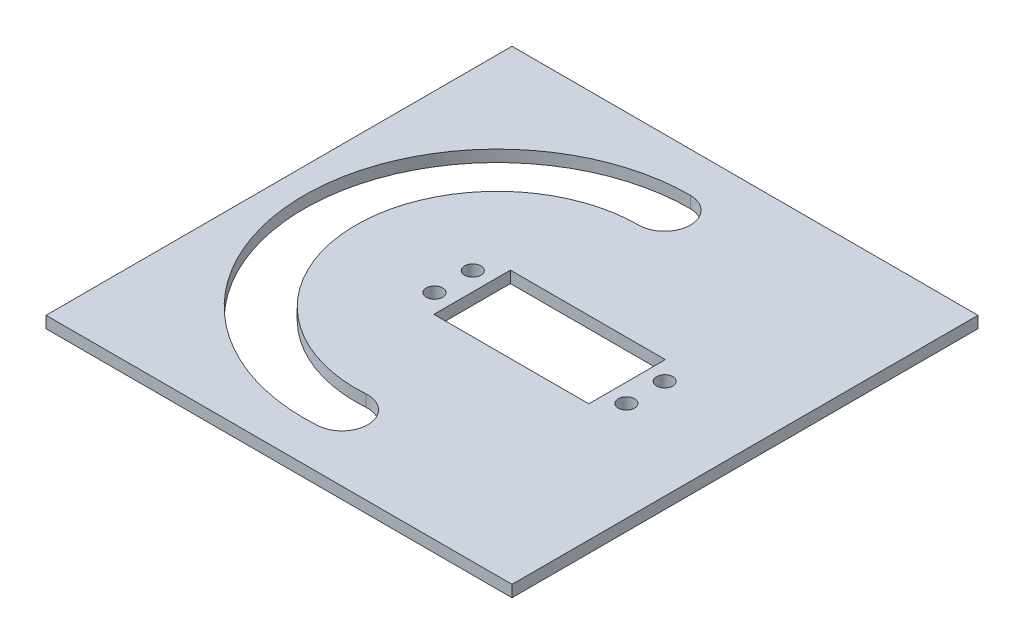
ISO-10303-21;
HEADER;
FILE_DESCRIPTION(('STEP AP214'),'2;1');
FILE_NAME('part.step','',(''),(''),'','','');
FILE_SCHEMA(('AUTOMOTIVE_DESIGN { 1 0 10303 214 1 1 1 1 }'));
ENDSEC;
DATA;
#1=APPLICATION_CONTEXT('core data for automotive mechanical design processes');
#2=APPLICATION_PROTOCOL_DEFINITION('international standard','automotive_design',2000,#1);
#3=PRODUCT_CONTEXT('',#1,'mechanical');
#4=PRODUCT('Part','Part','',(#3));
#5=PRODUCT_RELATED_PRODUCT_CATEGORY('part','',(#4));
#6=PRODUCT_DEFINITION_FORMATION('','',#4);
#7=PRODUCT_DEFINITION_CONTEXT('part definition',#1,'design');
#8=PRODUCT_DEFINITION('design','',#6,#7);
#9=PRODUCT_DEFINITION_SHAPE('','',#8);
#10=(LENGTH_UNIT() NAMED_UNIT(*) SI_UNIT(.MILLI.,.METRE.));
#11=(NAMED_UNIT(*) PLANE_ANGLE_UNIT() SI_UNIT($,.RADIAN.));
#12=(NAMED_UNIT(*) SI_UNIT($,.STERADIAN.) SOLID_ANGLE_UNIT());
#13=UNCERTAINTY_MEASURE_WITH_UNIT(LENGTH_MEASURE(1.E-05),#10,'distance_accuracy_value','');
#14=(GEOMETRIC_REPRESENTATION_CONTEXT(3) GLOBAL_UNCERTAINTY_ASSIGNED_CONTEXT((#13)) GLOBAL_UNIT_ASSIGNED_CONTEXT((#10,
#11,#12)) REPRESENTATION_CONTEXT('',''));
#15=CARTESIAN_POINT('',(0.,0.,0.));
#16=DIRECTION('',(0.,0.,1.));
#17=DIRECTION('',(1.,0.,0.));
#18=AXIS2_PLACEMENT_3D('',#15,#16,#17);
#19=CARTESIAN_POINT('',(-60.,73.,60.));
#20=DIRECTION('',(1.,0.,0.));
#21=DIRECTION('',(0.,0.,-1.));
#22=AXIS2_PLACEMENT_3D('',#19,#20,#21);
#23=PLANE('',#22);
#24=DIRECTION('',(0.,-1.,0.));
#25=VECTOR('',#24,1.);
#26=CARTESIAN_POINT('',(-60.,73.,-60.));
#27=LINE('',#26,#25);
#28=CARTESIAN_POINT('',(-60.,76.,-60.));
#29=VERTEX_POINT('',#28);
#30=CARTESIAN_POINT('',(-60.,73.,-60.));
#31=VERTEX_POINT('',#30);
#32=EDGE_CURVE('E139',#29,#31,#27,.T.);
#33=ORIENTED_EDGE('',*,*,#32,.T.);
#34=DIRECTION('',(0.,0.,1.));
#35=VECTOR('',#34,1.);
#36=CARTESIAN_POINT('',(-60.,73.,60.));
#37=LINE('',#36,#35);
#38=CARTESIAN_POINT('',(-60.,73.,60.));
#39=VERTEX_POINT('',#38);
#40=EDGE_CURVE('E48',#31,#39,#37,.T.);
#41=ORIENTED_EDGE('',*,*,#40,.T.);
#42=DIRECTION('',(0.,-1.,0.));
#43=VECTOR('',#42,1.);
#44=CARTESIAN_POINT('',(-60.,73.,60.));
#45=LINE('',#44,#43);
#46=CARTESIAN_POINT('',(-60.,76.,60.));
#47=VERTEX_POINT('',#46);
#48=EDGE_CURVE('E129',#47,#39,#45,.T.);
#49=ORIENTED_EDGE('',*,*,#48,.F.);
#50=DIRECTION('',(0.,0.,1.));
#51=VECTOR('',#50,1.);
#52=CARTESIAN_POINT('',(-60.,76.,-60.));
#53=LINE('',#52,#51);
#54=EDGE_CURVE('E149',#29,#47,#53,.T.);
#55=ORIENTED_EDGE('',*,*,#54,.F.);
#56=EDGE_LOOP('',(#33,#41,#49,#55));
#57=FACE_BOUND('',#56,.T.);
#58=ADVANCED_FACE('F32',(#57),#23,.F.);
#59=CARTESIAN_POINT('',(60.,73.,60.));
#60=DIRECTION('',(0.,0.,-1.));
#61=DIRECTION('',(-1.,0.,0.));
#62=AXIS2_PLACEMENT_3D('',#59,#60,#61);
#63=PLANE('',#62);
#64=ORIENTED_EDGE('',*,*,#48,.T.);
#65=DIRECTION('',(-1.,0.,0.));
#66=VECTOR('',#65,1.);
#67=CARTESIAN_POINT('',(-185.071335836762,73.,60.));
#68=LINE('',#67,#66);
#69=CARTESIAN_POINT('',(60.,73.,60.));
#70=VERTEX_POINT('',#69);
#71=EDGE_CURVE('E11',#70,#39,#68,.T.);
#72=ORIENTED_EDGE('',*,*,#71,.F.);
#73=DIRECTION('',(0.,-1.,0.));
#74=VECTOR('',#73,1.);
#75=CARTESIAN_POINT('',(60.,73.,60.));
#76=LINE('',#75,#74);
#77=CARTESIAN_POINT('',(60.,76.,60.));
#78=VERTEX_POINT('',#77);
#79=EDGE_CURVE('E122',#78,#70,#76,.T.);
#80=ORIENTED_EDGE('',*,*,#79,.F.);
#81=DIRECTION('',(1.,0.,0.));
#82=VECTOR('',#81,1.);
#83=CARTESIAN_POINT('',(-60.,76.,60.));
#84=LINE('',#83,#82);
#85=EDGE_CURVE('E147',#47,#78,#84,.T.);
#86=ORIENTED_EDGE('',*,*,#85,.F.);
#87=EDGE_LOOP('',(#64,#72,#80,#86));
#88=FACE_BOUND('',#87,.T.);
#89=ADVANCED_FACE('F126',(#88),#63,.F.);
#90=CARTESIAN_POINT('',(60.,73.,60.));
#91=DIRECTION('',(-1.,0.,0.));
#92=DIRECTION('',(0.,0.,1.));
#93=AXIS2_PLACEMENT_3D('',#90,#91,#92);
#94=PLANE('',#93);
#95=ORIENTED_EDGE('',*,*,#79,.T.);
#96=DIRECTION('',(0.,0.,-1.));
#97=VECTOR('',#96,1.);
#98=CARTESIAN_POINT('',(60.,73.,60.));
#99=LINE('',#98,#97);
#100=CARTESIAN_POINT('',(60.,73.,-60.));
#101=VERTEX_POINT('',#100);
#102=EDGE_CURVE('E115',#70,#101,#99,.T.);
#103=ORIENTED_EDGE('',*,*,#102,.T.);
#104=DIRECTION('',(0.,-1.,0.));
#105=VECTOR('',#104,1.);
#106=CARTESIAN_POINT('',(60.,73.,-60.));
#107=LINE('',#106,#105);
#108=CARTESIAN_POINT('',(60.,76.,-60.));
#109=VERTEX_POINT('',#108);
#110=EDGE_CURVE('E121',#109,#101,#107,.T.);
#111=ORIENTED_EDGE('',*,*,#110,.F.);
#112=DIRECTION('',(0.,0.,-1.));
#113=VECTOR('',#112,1.);
#114=CARTESIAN_POINT('',(60.,76.,-60.));
#115=LINE('',#114,#113);
#116=EDGE_CURVE('E133',#78,#109,#115,.T.);
#117=ORIENTED_EDGE('',*,*,#116,.F.);
#118=EDGE_LOOP('',(#95,#103,#111,#117));
#119=FACE_BOUND('',#118,.T.);
#120=ADVANCED_FACE('F131',(#119),#94,.F.);
#121=CARTESIAN_POINT('',(60.,73.,-60.));
#122=DIRECTION('',(0.,0.,1.));
#123=DIRECTION('',(1.,0.,0.));
#124=AXIS2_PLACEMENT_3D('',#121,#122,#123);
#125=PLANE('',#124);
#126=ORIENTED_EDGE('',*,*,#110,.T.);
#127=DIRECTION('',(-1.,0.,0.));
#128=VECTOR('',#127,1.);
#129=CARTESIAN_POINT('',(60.,73.,-60.));
#130=LINE('',#129,#128);
#131=EDGE_CURVE('E113',#101,#31,#130,.T.);
#132=ORIENTED_EDGE('',*,*,#131,.T.);
#133=ORIENTED_EDGE('',*,*,#32,.F.);
#134=DIRECTION('',(-1.,0.,0.));
#135=VECTOR('',#134,1.);
#136=CARTESIAN_POINT('',(-60.,76.,-60.));
#137=LINE('',#136,#135);
#138=EDGE_CURVE('E142',#109,#29,#137,.T.);
#139=ORIENTED_EDGE('',*,*,#138,.F.);
#140=EDGE_LOOP('',(#126,#132,#133,#139));
#141=FACE_BOUND('',#140,.T.);
#142=ADVANCED_FACE('F229',(#141),#125,.F.);
#143=CARTESIAN_POINT('',(0.,76.,0.));
#144=DIRECTION('',(0.,1.,0.));
#145=DIRECTION('',(0.,0.,1.));
#146=AXIS2_PLACEMENT_3D('',#143,#144,#145);
#147=PLANE('',#146);
#148=CARTESIAN_POINT('',(-3.79258235859657,76.,-43.0768250109496));
#149=DIRECTION('',(0.,1.,0.));
#150=DIRECTION('',(0.,0.,1.));
#151=AXIS2_PLACEMENT_3D('',#148,#149,#150);
#152=CIRCLE('',#151,6.65194004098067);
#153=CARTESIAN_POINT('',(-3.79258235859754,76.,-36.4248849699689));
#154=VERTEX_POINT('',#153);
#155=CARTESIAN_POINT('',(-3.7925823585956,76.,-49.7287650519302));
#156=VERTEX_POINT('',#155);
#157=EDGE_CURVE('E219',#154,#156,#152,.T.);
#158=ORIENTED_EDGE('',*,*,#157,.F.);
#159=CARTESIAN_POINT('',(-3.79258235860283,76.,0.));
#160=DIRECTION('',(0.,-1.,0.));
#161=DIRECTION('',(0.,0.,1.));
#162=AXIS2_PLACEMENT_3D('',#159,#160,#161);
#163=CIRCLE('',#162,36.4248849699689);
#164=CARTESIAN_POINT('',(-1.27061659920125,76.,36.3374728590731));
#165=VERTEX_POINT('',#164);
#166=EDGE_CURVE('E216',#165,#154,#163,.T.);
#167=ORIENTED_EDGE('',*,*,#166,.F.);
#168=CARTESIAN_POINT('',(-0.810053304882636,76.,42.9734496342531));
#169=DIRECTION('',(0.,1.,0.));
#170=DIRECTION('',(0.,0.,1.));
#171=AXIS2_PLACEMENT_3D('',#168,#169,#170);
#172=CIRCLE('',#171,6.65194004098067);
#173=CARTESIAN_POINT('',(-0.349490010564004,76.,49.6094264094331));
#174=VERTEX_POINT('',#173);
#175=EDGE_CURVE('E213',#174,#165,#172,.T.);
#176=ORIENTED_EDGE('',*,*,#175,.F.);
#177=CARTESIAN_POINT('',(-3.79258235860283,76.,0.));
#178=DIRECTION('',(0.,1.,0.));
#179=DIRECTION('',(0.,0.,1.));
#180=AXIS2_PLACEMENT_3D('',#177,#178,#179);
#181=CIRCLE('',#180,49.7287650519302);
#182=EDGE_CURVE('E41',#156,#174,#181,.T.);
#183=ORIENTED_EDGE('',*,*,#182,.F.);
#184=EDGE_LOOP('',(#158,#167,#176,#183));
#185=FACE_BOUND('',#184,.T.);
#186=CARTESIAN_POINT('',(-15.03,76.,4.92500000000001));
#187=DIRECTION('',(0.,1.,0.));
#188=DIRECTION('',(0.,0.,1.));
#189=AXIS2_PLACEMENT_3D('',#186,#187,#188);
#190=CIRCLE('',#189,2.1);
#191=CARTESIAN_POINT('',(-15.03,76.,7.025));
#192=VERTEX_POINT('',#191);
#193=EDGE_CURVE('E173',#192,#192,#190,.T.);
#194=ORIENTED_EDGE('',*,*,#193,.F.);
#195=EDGE_LOOP('',(#194));
#196=FACE_BOUND('',#195,.T.);
#197=CARTESIAN_POINT('',(-15.03,76.,-4.925));
#198=DIRECTION('',(0.,1.,0.));
#199=DIRECTION('',(0.,0.,1.));
#200=AXIS2_PLACEMENT_3D('',#197,#198,#199);
#201=CIRCLE('',#200,2.1);
#202=CARTESIAN_POINT('',(-15.03,76.,-2.825));
#203=VERTEX_POINT('',#202);
#204=EDGE_CURVE('E190',#203,#203,#201,.T.);
#205=ORIENTED_EDGE('',*,*,#204,.F.);
#206=EDGE_LOOP('',(#205));
#207=FACE_BOUND('',#206,.T.);
#208=CARTESIAN_POINT('',(34.39,76.,-4.925));
#209=DIRECTION('',(0.,1.,0.));
#210=DIRECTION('',(0.,0.,1.));
#211=AXIS2_PLACEMENT_3D('',#208,#209,#210);
#212=CIRCLE('',#211,2.1);
#213=CARTESIAN_POINT('',(34.39,76.,-2.825));
#214=VERTEX_POINT('',#213);
#215=EDGE_CURVE('E196',#214,#214,#212,.T.);
#216=ORIENTED_EDGE('',*,*,#215,.F.);
#217=EDGE_LOOP('',(#216));
#218=FACE_BOUND('',#217,.T.);
#219=CARTESIAN_POINT('',(34.39,76.,4.92500000000001));
#220=DIRECTION('',(0.,1.,0.));
#221=DIRECTION('',(0.,0.,1.));
#222=AXIS2_PLACEMENT_3D('',#219,#220,#221);
#223=CIRCLE('',#222,2.1);
#224=CARTESIAN_POINT('',(34.39,76.,7.025));
#225=VERTEX_POINT('',#224);
#226=EDGE_CURVE('E145',#225,#225,#223,.T.);
#227=ORIENTED_EDGE('',*,*,#226,.F.);
#228=EDGE_LOOP('',(#227));
#229=FACE_BOUND('',#228,.T.);
#230=DIRECTION('',(0.,0.,-1.));
#231=VECTOR('',#230,1.);
#232=CARTESIAN_POINT('',(29.63,76.,9.855));
#233=LINE('',#232,#231);
#234=CARTESIAN_POINT('',(29.63,76.,9.855));
#235=VERTEX_POINT('',#234);
#236=CARTESIAN_POINT('',(29.63,76.,-9.855));
#237=VERTEX_POINT('',#236);
#238=EDGE_CURVE('E165',#235,#237,#233,.T.);
#239=ORIENTED_EDGE('',*,*,#238,.F.);
#240=DIRECTION('',(1.,0.,0.));
#241=VECTOR('',#240,1.);
#242=CARTESIAN_POINT('',(-10.27,76.,9.855));
#243=LINE('',#242,#241);
#244=CARTESIAN_POINT('',(-10.27,76.,9.855));
#245=VERTEX_POINT('',#244);
#246=EDGE_CURVE('E162',#245,#235,#243,.T.);
#247=ORIENTED_EDGE('',*,*,#246,.F.);
#248=DIRECTION('',(0.,0.,1.));
#249=VECTOR('',#248,1.);
#250=CARTESIAN_POINT('',(-10.27,76.,9.855));
#251=LINE('',#250,#249);
#252=CARTESIAN_POINT('',(-10.27,76.,-9.855));
#253=VERTEX_POINT('',#252);
#254=EDGE_CURVE('E159',#253,#245,#251,.T.);
#255=ORIENTED_EDGE('',*,*,#254,.F.);
#256=DIRECTION('',(-1.,0.,0.));
#257=VECTOR('',#256,1.);
#258=CARTESIAN_POINT('',(-10.27,76.,-9.855));
#259=LINE('',#258,#257);
#260=EDGE_CURVE('E156',#237,#253,#259,.T.);
#261=ORIENTED_EDGE('',*,*,#260,.F.);
#262=EDGE_LOOP('',(#239,#247,#255,#261));
#263=FACE_BOUND('',#262,.T.);
#264=ORIENTED_EDGE('',*,*,#54,.T.);
#265=ORIENTED_EDGE('',*,*,#85,.T.);
#266=ORIENTED_EDGE('',*,*,#116,.T.);
#267=ORIENTED_EDGE('',*,*,#138,.T.);
#268=EDGE_LOOP('',(#264,#265,#266,#267));
#269=FACE_BOUND('',#268,.T.);
#270=ADVANCED_FACE('F234',(#185,#196,#207,#218,#229,#263,#269),#147,.T.);
#271=CARTESIAN_POINT('',(34.39,73.,4.92500000000001));
#272=DIRECTION('',(0.,1.,0.));
#273=DIRECTION('',(0.,0.,1.));
#274=AXIS2_PLACEMENT_3D('',#271,#272,#273);
#275=CYLINDRICAL_SURFACE('',#274,2.1);
#276=CARTESIAN_POINT('',(34.39,73.,4.92500000000001));
#277=DIRECTION('',(0.,1.,0.));
#278=DIRECTION('',(0.,0.,1.));
#279=AXIS2_PLACEMENT_3D('',#276,#277,#278);
#280=CIRCLE('',#279,2.1);
#281=CARTESIAN_POINT('',(34.39,73.,7.025));
#282=VERTEX_POINT('',#281);
#283=EDGE_CURVE('E204',#282,#282,#280,.T.);
#284=ORIENTED_EDGE('',*,*,#283,.F.);
#285=EDGE_LOOP('',(#284));
#286=FACE_BOUND('',#285,.T.);
#287=ORIENTED_EDGE('',*,*,#226,.T.);
#288=EDGE_LOOP('',(#287));
#289=FACE_BOUND('',#288,.T.);
#290=ADVANCED_FACE('F236',(#286,#289),#275,.F.);
#291=CARTESIAN_POINT('',(34.39,73.,-4.925));
#292=DIRECTION('',(0.,1.,0.));
#293=DIRECTION('',(0.,0.,1.));
#294=AXIS2_PLACEMENT_3D('',#291,#292,#293);
#295=CYLINDRICAL_SURFACE('',#294,2.1);
#296=CARTESIAN_POINT('',(34.39,73.,-4.925));
#297=DIRECTION('',(0.,1.,0.));
#298=DIRECTION('',(0.,0.,1.));
#299=AXIS2_PLACEMENT_3D('',#296,#297,#298);
#300=CIRCLE('',#299,2.1);
#301=CARTESIAN_POINT('',(34.39,73.,-2.825));
#302=VERTEX_POINT('',#301);
#303=EDGE_CURVE('E199',#302,#302,#300,.T.);
#304=ORIENTED_EDGE('',*,*,#303,.F.);
#305=EDGE_LOOP('',(#304));
#306=FACE_BOUND('',#305,.T.);
#307=ORIENTED_EDGE('',*,*,#215,.T.);
#308=EDGE_LOOP('',(#307));
#309=FACE_BOUND('',#308,.T.);
#310=ADVANCED_FACE('F243',(#306,#309),#295,.F.);
#311=CARTESIAN_POINT('',(-15.03,73.,-4.925));
#312=DIRECTION('',(0.,1.,0.));
#313=DIRECTION('',(0.,0.,1.));
#314=AXIS2_PLACEMENT_3D('',#311,#312,#313);
#315=CYLINDRICAL_SURFACE('',#314,2.1);
#316=CARTESIAN_POINT('',(-15.03,73.,-4.925));
#317=DIRECTION('',(0.,1.,0.));
#318=DIRECTION('',(0.,0.,1.));
#319=AXIS2_PLACEMENT_3D('',#316,#317,#318);
#320=CIRCLE('',#319,2.1);
#321=CARTESIAN_POINT('',(-15.03,73.,-2.825));
#322=VERTEX_POINT('',#321);
#323=EDGE_CURVE('E193',#322,#322,#320,.T.);
#324=ORIENTED_EDGE('',*,*,#323,.F.);
#325=EDGE_LOOP('',(#324));
#326=FACE_BOUND('',#325,.T.);
#327=ORIENTED_EDGE('',*,*,#204,.T.);
#328=EDGE_LOOP('',(#327));
#329=FACE_BOUND('',#328,.T.);
#330=ADVANCED_FACE('F313',(#326,#329),#315,.F.);
#331=CARTESIAN_POINT('',(-15.03,73.,4.92500000000001));
#332=DIRECTION('',(0.,1.,0.));
#333=DIRECTION('',(0.,0.,1.));
#334=AXIS2_PLACEMENT_3D('',#331,#332,#333);
#335=CYLINDRICAL_SURFACE('',#334,2.1);
#336=CARTESIAN_POINT('',(-15.03,73.,4.92500000000001));
#337=DIRECTION('',(0.,1.,0.));
#338=DIRECTION('',(0.,0.,1.));
#339=AXIS2_PLACEMENT_3D('',#336,#337,#338);
#340=CIRCLE('',#339,2.1);
#341=CARTESIAN_POINT('',(-15.03,73.,7.025));
#342=VERTEX_POINT('',#341);
#343=EDGE_CURVE('E182',#342,#342,#340,.T.);
#344=ORIENTED_EDGE('',*,*,#343,.F.);
#345=EDGE_LOOP('',(#344));
#346=FACE_BOUND('',#345,.T.);
#347=ORIENTED_EDGE('',*,*,#193,.T.);
#348=EDGE_LOOP('',(#347));
#349=FACE_BOUND('',#348,.T.);
#350=ADVANCED_FACE('F309',(#346,#349),#335,.F.);
#351=CARTESIAN_POINT('',(29.63,73.,9.855));
#352=DIRECTION('',(1.,0.,0.));
#353=DIRECTION('',(0.,0.,-1.));
#354=AXIS2_PLACEMENT_3D('',#351,#352,#353);
#355=PLANE('',#354);
#356=ORIENTED_EDGE('',*,*,#238,.T.);
#357=DIRECTION('',(0.,1.,0.));
#358=VECTOR('',#357,1.);
#359=CARTESIAN_POINT('',(29.63,73.,-9.855));
#360=LINE('',#359,#358);
#361=CARTESIAN_POINT('',(29.63,73.,-9.855));
#362=VERTEX_POINT('',#361);
#363=EDGE_CURVE('E152',#362,#237,#360,.T.);
#364=ORIENTED_EDGE('',*,*,#363,.F.);
#365=DIRECTION('',(0.,0.,-1.));
#366=VECTOR('',#365,1.);
#367=CARTESIAN_POINT('',(29.63,73.,9.855));
#368=LINE('',#367,#366);
#369=CARTESIAN_POINT('',(29.63,73.,9.855));
#370=VERTEX_POINT('',#369);
#371=EDGE_CURVE('E177',#370,#362,#368,.T.);
#372=ORIENTED_EDGE('',*,*,#371,.F.);
#373=DIRECTION('',(0.,1.,0.));
#374=VECTOR('',#373,1.);
#375=CARTESIAN_POINT('',(29.63,73.,9.855));
#376=LINE('',#375,#374);
#377=EDGE_CURVE('E163',#370,#235,#376,.T.);
#378=ORIENTED_EDGE('',*,*,#377,.T.);
#379=EDGE_LOOP('',(#356,#364,#372,#378));
#380=FACE_BOUND('',#379,.T.);
#381=ADVANCED_FACE('F295',(#380),#355,.F.);
#382=CARTESIAN_POINT('',(-10.27,73.,9.855));
#383=DIRECTION('',(0.,0.,1.));
#384=DIRECTION('',(1.,0.,0.));
#385=AXIS2_PLACEMENT_3D('',#382,#383,#384);
#386=PLANE('',#385);
#387=ORIENTED_EDGE('',*,*,#246,.T.);
#388=ORIENTED_EDGE('',*,*,#377,.F.);
#389=DIRECTION('',(1.,0.,0.));
#390=VECTOR('',#389,1.);
#391=CARTESIAN_POINT('',(-10.27,73.,9.855));
#392=LINE('',#391,#390);
#393=CARTESIAN_POINT('',(-10.27,73.,9.855));
#394=VERTEX_POINT('',#393);
#395=EDGE_CURVE('E174',#394,#370,#392,.T.);
#396=ORIENTED_EDGE('',*,*,#395,.F.);
#397=DIRECTION('',(0.,1.,0.));
#398=VECTOR('',#397,1.);
#399=CARTESIAN_POINT('',(-10.27,73.,9.855));
#400=LINE('',#399,#398);
#401=EDGE_CURVE('E160',#394,#245,#400,.T.);
#402=ORIENTED_EDGE('',*,*,#401,.T.);
#403=EDGE_LOOP('',(#387,#388,#396,#402));
#404=FACE_BOUND('',#403,.T.);
#405=ADVANCED_FACE('F301',(#404),#386,.F.);
#406=CARTESIAN_POINT('',(-10.27,73.,9.855));
#407=DIRECTION('',(-1.,0.,0.));
#408=DIRECTION('',(0.,0.,1.));
#409=AXIS2_PLACEMENT_3D('',#406,#407,#408);
#410=PLANE('',#409);
#411=ORIENTED_EDGE('',*,*,#254,.T.);
#412=ORIENTED_EDGE('',*,*,#401,.F.);
#413=DIRECTION('',(0.,0.,1.));
#414=VECTOR('',#413,1.);
#415=CARTESIAN_POINT('',(-10.27,73.,9.855));
#416=LINE('',#415,#414);
#417=CARTESIAN_POINT('',(-10.27,73.,-9.855));
#418=VERTEX_POINT('',#417);
#419=EDGE_CURVE('E179',#418,#394,#416,.T.);
#420=ORIENTED_EDGE('',*,*,#419,.F.);
#421=DIRECTION('',(0.,1.,0.));
#422=VECTOR('',#421,1.);
#423=CARTESIAN_POINT('',(-10.27,73.,-9.855));
#424=LINE('',#423,#422);
#425=EDGE_CURVE('E157',#418,#253,#424,.T.);
#426=ORIENTED_EDGE('',*,*,#425,.T.);
#427=EDGE_LOOP('',(#411,#412,#420,#426));
#428=FACE_BOUND('',#427,.T.);
#429=ADVANCED_FACE('F270',(#428),#410,.F.);
#430=CARTESIAN_POINT('',(-10.27,73.,-9.855));
#431=DIRECTION('',(0.,0.,-1.));
#432=DIRECTION('',(-1.,0.,0.));
#433=AXIS2_PLACEMENT_3D('',#430,#431,#432);
#434=PLANE('',#433);
#435=ORIENTED_EDGE('',*,*,#260,.T.);
#436=ORIENTED_EDGE('',*,*,#425,.F.);
#437=DIRECTION('',(-1.,0.,0.));
#438=VECTOR('',#437,1.);
#439=CARTESIAN_POINT('',(-10.27,73.,-9.855));
#440=LINE('',#439,#438);
#441=EDGE_CURVE('E183',#362,#418,#440,.T.);
#442=ORIENTED_EDGE('',*,*,#441,.F.);
#443=ORIENTED_EDGE('',*,*,#363,.T.);
#444=EDGE_LOOP('',(#435,#436,#442,#443));
#445=FACE_BOUND('',#444,.T.);
#446=ADVANCED_FACE('F261',(#445),#434,.F.);
#447=CARTESIAN_POINT('',(0.,73.,0.));
#448=DIRECTION('',(0.,1.,0.));
#449=DIRECTION('',(0.,0.,1.));
#450=AXIS2_PLACEMENT_3D('',#447,#448,#449);
#451=PLANE('',#450);
#452=CARTESIAN_POINT('',(-3.79258235860283,73.,0.));
#453=DIRECTION('',(0.,1.,0.));
#454=DIRECTION('',(0.,0.,1.));
#455=AXIS2_PLACEMENT_3D('',#452,#453,#454);
#456=CIRCLE('',#455,36.4248849699689);
#457=CARTESIAN_POINT('',(-1.27061659920125,73.,36.3374728590731));
#458=VERTEX_POINT('',#457);
#459=CARTESIAN_POINT('',(-3.79258235859754,73.,-36.4248849699689));
#460=VERTEX_POINT('',#459);
#461=EDGE_CURVE('E155',#458,#460,#456,.F.);
#462=ORIENTED_EDGE('',*,*,#461,.T.);
#463=CARTESIAN_POINT('',(-3.79258235859657,73.,-43.0768250109496));
#464=DIRECTION('',(0.,1.,0.));
#465=DIRECTION('',(0.,0.,1.));
#466=AXIS2_PLACEMENT_3D('',#463,#464,#465);
#467=CIRCLE('',#466,6.65194004098067);
#468=CARTESIAN_POINT('',(-3.7925823585956,73.,-49.7287650519302));
#469=VERTEX_POINT('',#468);
#470=EDGE_CURVE('E341',#460,#469,#467,.T.);
#471=ORIENTED_EDGE('',*,*,#470,.T.);
#472=CARTESIAN_POINT('',(-3.79258235860283,73.,0.));
#473=DIRECTION('',(0.,1.,0.));
#474=DIRECTION('',(0.,0.,1.));
#475=AXIS2_PLACEMENT_3D('',#472,#473,#474);
#476=CIRCLE('',#475,49.7287650519302);
#477=CARTESIAN_POINT('',(-0.349490010564004,73.,49.6094264094331));
#478=VERTEX_POINT('',#477);
#479=EDGE_CURVE('E339',#469,#478,#476,.T.);
#480=ORIENTED_EDGE('',*,*,#479,.T.);
#481=CARTESIAN_POINT('',(-0.810053304882636,73.,42.9734496342531));
#482=DIRECTION('',(0.,1.,0.));
#483=DIRECTION('',(0.,0.,1.));
#484=AXIS2_PLACEMENT_3D('',#481,#482,#483);
#485=CIRCLE('',#484,6.65194004098067);
#486=EDGE_CURVE('E178',#478,#458,#485,.T.);
#487=ORIENTED_EDGE('',*,*,#486,.T.);
#488=EDGE_LOOP('',(#462,#471,#480,#487));
#489=FACE_BOUND('',#488,.T.);
#490=ORIENTED_EDGE('',*,*,#395,.T.);
#491=ORIENTED_EDGE('',*,*,#371,.T.);
#492=ORIENTED_EDGE('',*,*,#441,.T.);
#493=ORIENTED_EDGE('',*,*,#419,.T.);
#494=EDGE_LOOP('',(#490,#491,#492,#493));
#495=FACE_BOUND('',#494,.T.);
#496=ORIENTED_EDGE('',*,*,#343,.T.);
#497=EDGE_LOOP('',(#496));
#498=FACE_BOUND('',#497,.T.);
#499=ORIENTED_EDGE('',*,*,#323,.T.);
#500=EDGE_LOOP('',(#499));
#501=FACE_BOUND('',#500,.T.);
#502=ORIENTED_EDGE('',*,*,#303,.T.);
#503=EDGE_LOOP('',(#502));
#504=FACE_BOUND('',#503,.T.);
#505=ORIENTED_EDGE('',*,*,#283,.T.);
#506=EDGE_LOOP('',(#505));
#507=FACE_BOUND('',#506,.T.);
#508=ORIENTED_EDGE('',*,*,#131,.F.);
#509=ORIENTED_EDGE('',*,*,#102,.F.);
#510=ORIENTED_EDGE('',*,*,#71,.T.);
#511=ORIENTED_EDGE('',*,*,#40,.F.);
#512=EDGE_LOOP('',(#508,#509,#510,#511));
#513=FACE_BOUND('',#512,.T.);
#514=ADVANCED_FACE('F117',(#489,#495,#498,#501,#504,#507,#513),#451,.F.);
#515=CARTESIAN_POINT('',(-3.79258235859657,71.,-43.0768250109496));
#516=DIRECTION('',(0.,1.,0.));
#517=DIRECTION('',(0.,0.,1.));
#518=AXIS2_PLACEMENT_3D('',#515,#516,#517);
#519=CYLINDRICAL_SURFACE('',#518,6.65194004098067);
#520=DIRECTION('',(0.,1.,0.));
#521=VECTOR('',#520,1.);
#522=CARTESIAN_POINT('',(-3.79258235859754,71.,-36.4248849699689));
#523=LINE('',#522,#521);
#524=EDGE_CURVE('E209',#460,#154,#523,.T.);
#525=ORIENTED_EDGE('',*,*,#524,.T.);
#526=ORIENTED_EDGE('',*,*,#157,.T.);
#527=DIRECTION('',(0.,1.,0.));
#528=VECTOR('',#527,1.);
#529=CARTESIAN_POINT('',(-3.7925823585956,71.,-49.7287650519302));
#530=LINE('',#529,#528);
#531=EDGE_CURVE('E210',#469,#156,#530,.T.);
#532=ORIENTED_EDGE('',*,*,#531,.F.);
#533=ORIENTED_EDGE('',*,*,#470,.F.);
#534=EDGE_LOOP('',(#525,#526,#532,#533));
#535=FACE_BOUND('',#534,.T.);
#536=ADVANCED_FACE('F260',(#535),#519,.F.);
#537=CARTESIAN_POINT('',(-3.79258235860283,71.,0.));
#538=DIRECTION('',(0.,1.,0.));
#539=DIRECTION('',(0.,0.,1.));
#540=AXIS2_PLACEMENT_3D('',#537,#538,#539);
#541=CYLINDRICAL_SURFACE('',#540,36.4248849699689);
#542=DIRECTION('',(0.,1.,0.));
#543=VECTOR('',#542,1.);
#544=CARTESIAN_POINT('',(-1.27061659920125,71.,36.3374728590731));
#545=LINE('',#544,#543);
#546=EDGE_CURVE('E217',#458,#165,#545,.T.);
#547=ORIENTED_EDGE('',*,*,#546,.T.);
#548=ORIENTED_EDGE('',*,*,#166,.T.);
#549=ORIENTED_EDGE('',*,*,#524,.F.);
#550=ORIENTED_EDGE('',*,*,#461,.F.);
#551=EDGE_LOOP('',(#547,#548,#549,#550));
#552=FACE_BOUND('',#551,.T.);
#553=ADVANCED_FACE('F34',(#552),#541,.T.);
#554=CARTESIAN_POINT('',(-0.810053304882636,71.,42.9734496342531));
#555=DIRECTION('',(0.,1.,0.));
#556=DIRECTION('',(0.,0.,1.));
#557=AXIS2_PLACEMENT_3D('',#554,#555,#556);
#558=CYLINDRICAL_SURFACE('',#557,6.65194004098067);
#559=DIRECTION('',(0.,1.,0.));
#560=VECTOR('',#559,1.);
#561=CARTESIAN_POINT('',(-0.349490010564004,71.,49.6094264094331));
#562=LINE('',#561,#560);
#563=EDGE_CURVE('E214',#478,#174,#562,.T.);
#564=ORIENTED_EDGE('',*,*,#563,.T.);
#565=ORIENTED_EDGE('',*,*,#175,.T.);
#566=ORIENTED_EDGE('',*,*,#546,.F.);
#567=ORIENTED_EDGE('',*,*,#486,.F.);
#568=EDGE_LOOP('',(#564,#565,#566,#567));
#569=FACE_BOUND('',#568,.T.);
#570=ADVANCED_FACE('F323',(#569),#558,.F.);
#571=CARTESIAN_POINT('',(-3.79258235860283,71.,0.));
#572=DIRECTION('',(0.,1.,0.));
#573=DIRECTION('',(0.,0.,1.));
#574=AXIS2_PLACEMENT_3D('',#571,#572,#573);
#575=CYLINDRICAL_SURFACE('',#574,49.7287650519302);
#576=ORIENTED_EDGE('',*,*,#531,.T.);
#577=ORIENTED_EDGE('',*,*,#182,.T.);
#578=ORIENTED_EDGE('',*,*,#563,.F.);
#579=ORIENTED_EDGE('',*,*,#479,.F.);
#580=EDGE_LOOP('',(#576,#577,#578,#579));
#581=FACE_BOUND('',#580,.T.);
#582=ADVANCED_FACE('F321',(#581),#575,.F.);
#583=CLOSED_SHELL('',(#58,#89,#120,#142,#270,#290,#310,#330,#350,#381,#405,#429,#446,#514,#536,
#553,#570,#582));
#584=MANIFOLD_SOLID_BREP('B2',#583);
#585=ADVANCED_BREP_SHAPE_REPRESENTATION('',(#18,#584),#14);
#586=SHAPE_DEFINITION_REPRESENTATION(#9,#585);
ENDSEC;
END-ISO-10303-21;
